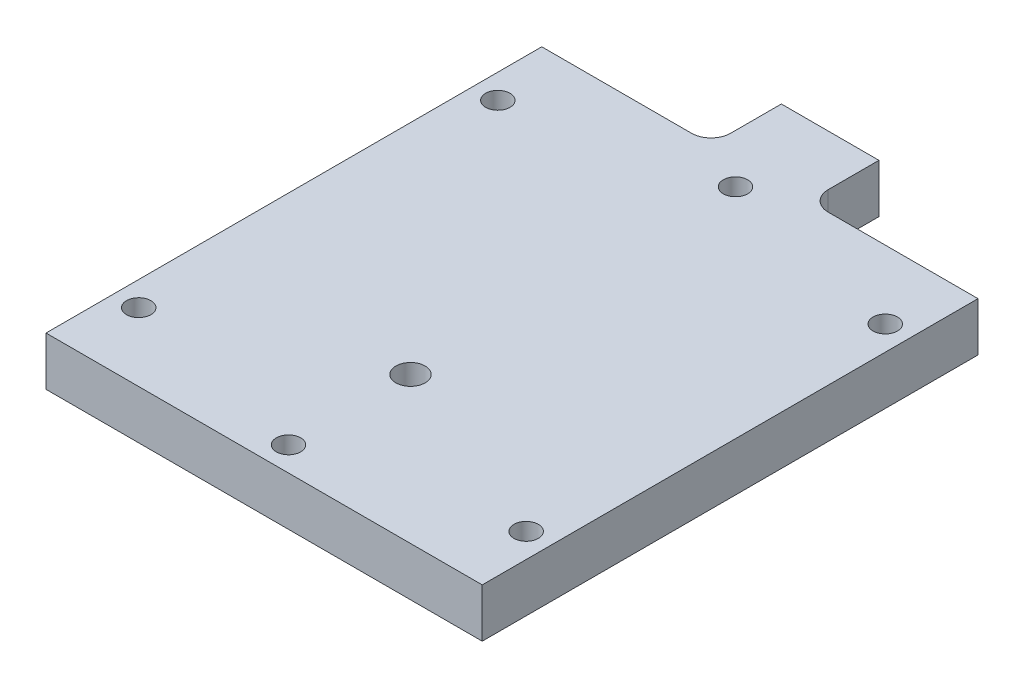
ISO-10303-21;
HEADER;
FILE_DESCRIPTION(('STEP AP214'),'2;1');
FILE_NAME('part.step','',(''),(''),'','','');
FILE_SCHEMA(('AUTOMOTIVE_DESIGN { 1 0 10303 214 1 1 1 1 }'));
ENDSEC;
DATA;
#1=APPLICATION_CONTEXT('core data for automotive mechanical design processes');
#2=APPLICATION_PROTOCOL_DEFINITION('international standard','automotive_design',2000,#1);
#3=PRODUCT_CONTEXT('',#1,'mechanical');
#4=PRODUCT('Part','Part','',(#3));
#5=PRODUCT_RELATED_PRODUCT_CATEGORY('part','',(#4));
#6=PRODUCT_DEFINITION_FORMATION('','',#4);
#7=PRODUCT_DEFINITION_CONTEXT('part definition',#1,'design');
#8=PRODUCT_DEFINITION('design','',#6,#7);
#9=PRODUCT_DEFINITION_SHAPE('','',#8);
#10=(LENGTH_UNIT() NAMED_UNIT(*) SI_UNIT(.MILLI.,.METRE.));
#11=(NAMED_UNIT(*) PLANE_ANGLE_UNIT() SI_UNIT($,.RADIAN.));
#12=(NAMED_UNIT(*) SI_UNIT($,.STERADIAN.) SOLID_ANGLE_UNIT());
#13=UNCERTAINTY_MEASURE_WITH_UNIT(LENGTH_MEASURE(1.E-05),#10,'distance_accuracy_value','');
#14=(GEOMETRIC_REPRESENTATION_CONTEXT(3) GLOBAL_UNCERTAINTY_ASSIGNED_CONTEXT((#13)) GLOBAL_UNIT_ASSIGNED_CONTEXT((#10,
#11,#12)) REPRESENTATION_CONTEXT('',''));
#15=CARTESIAN_POINT('',(0.,0.,0.));
#16=DIRECTION('',(0.,0.,1.));
#17=DIRECTION('',(1.,0.,0.));
#18=AXIS2_PLACEMENT_3D('',#15,#16,#17);
#19=CARTESIAN_POINT('',(7.,5.,-37.7999999999999));
#20=DIRECTION('',(0.,1.,0.));
#21=DIRECTION('',(0.,0.,1.));
#22=AXIS2_PLACEMENT_3D('',#19,#20,#21);
#23=PLANE('',#22);
#24=CARTESIAN_POINT('',(0.,5.,-33.3));
#25=DIRECTION('',(0.,1.,0.));
#26=DIRECTION('',(0.,0.,1.));
#27=AXIS2_PLACEMENT_3D('',#24,#25,#26);
#28=CIRCLE('',#27,1.24999999999999);
#29=CARTESIAN_POINT('',(0.,5.,-32.05));
#30=VERTEX_POINT('',#29);
#31=EDGE_CURVE('E243',#30,#30,#28,.T.);
#32=ORIENTED_EDGE('',*,*,#31,.F.);
#33=EDGE_LOOP('',(#32));
#34=FACE_BOUND('',#33,.T.);
#35=CARTESIAN_POINT('',(19.8500000000001,5.,-28.8000000000002));
#36=DIRECTION('',(0.,1.,0.));
#37=DIRECTION('',(0.,0.,1.));
#38=AXIS2_PLACEMENT_3D('',#35,#36,#37);
#39=CIRCLE('',#38,1.24999999999999);
#40=CARTESIAN_POINT('',(19.8500000000001,5.,-27.5500000000002));
#41=VERTEX_POINT('',#40);
#42=EDGE_CURVE('E237',#41,#41,#39,.T.);
#43=ORIENTED_EDGE('',*,*,#42,.F.);
#44=EDGE_LOOP('',(#43));
#45=FACE_BOUND('',#44,.T.);
#46=CARTESIAN_POINT('',(19.85,5.,7.99999999999989));
#47=DIRECTION('',(0.,1.,0.));
#48=DIRECTION('',(0.,0.,1.));
#49=AXIS2_PLACEMENT_3D('',#46,#47,#48);
#50=CIRCLE('',#49,1.24999999999999);
#51=CARTESIAN_POINT('',(19.85,5.,9.24999999999988));
#52=VERTEX_POINT('',#51);
#53=EDGE_CURVE('E231',#52,#52,#50,.T.);
#54=ORIENTED_EDGE('',*,*,#53,.F.);
#55=EDGE_LOOP('',(#54));
#56=FACE_BOUND('',#55,.T.);
#57=CARTESIAN_POINT('',(0.,5.,12.5000000000001));
#58=DIRECTION('',(0.,1.,0.));
#59=DIRECTION('',(0.,0.,1.));
#60=AXIS2_PLACEMENT_3D('',#57,#58,#59);
#61=CIRCLE('',#60,1.24999999999999);
#62=CARTESIAN_POINT('',(0.,5.,13.7500000000001));
#63=VERTEX_POINT('',#62);
#64=EDGE_CURVE('E225',#63,#63,#61,.T.);
#65=ORIENTED_EDGE('',*,*,#64,.F.);
#66=EDGE_LOOP('',(#65));
#67=FACE_BOUND('',#66,.T.);
#68=CARTESIAN_POINT('',(-19.8500000000001,5.,-28.8000000000002));
#69=DIRECTION('',(0.,1.,0.));
#70=DIRECTION('',(0.,0.,1.));
#71=AXIS2_PLACEMENT_3D('',#68,#69,#70);
#72=CIRCLE('',#71,1.24999999999999);
#73=CARTESIAN_POINT('',(-19.8500000000001,5.,-27.5500000000002));
#74=VERTEX_POINT('',#73);
#75=EDGE_CURVE('E219',#74,#74,#72,.T.);
#76=ORIENTED_EDGE('',*,*,#75,.F.);
#77=EDGE_LOOP('',(#76));
#78=FACE_BOUND('',#77,.T.);
#79=CARTESIAN_POINT('',(-19.8500000000001,5.,8.00000000000004));
#80=DIRECTION('',(0.,1.,0.));
#81=DIRECTION('',(0.,0.,1.));
#82=AXIS2_PLACEMENT_3D('',#79,#80,#81);
#83=CIRCLE('',#82,1.24999999999999);
#84=CARTESIAN_POINT('',(-19.8500000000001,5.,9.25000000000002));
#85=VERTEX_POINT('',#84);
#86=EDGE_CURVE('E213',#85,#85,#83,.T.);
#87=ORIENTED_EDGE('',*,*,#86,.F.);
#88=EDGE_LOOP('',(#87));
#89=FACE_BOUND('',#88,.T.);
#90=DIRECTION('',(0.,0.,1.));
#91=VECTOR('',#90,1.);
#92=CARTESIAN_POINT('',(-22.3500000000001,5.,-35.7999999999999));
#93=LINE('',#92,#91);
#94=CARTESIAN_POINT('',(-22.3500000000001,5.,-35.7999999999999));
#95=VERTEX_POINT('',#94);
#96=CARTESIAN_POINT('',(-22.35,5.,15.));
#97=VERTEX_POINT('',#96);
#98=EDGE_CURVE('E160',#95,#97,#93,.T.);
#99=ORIENTED_EDGE('',*,*,#98,.T.);
#100=DIRECTION('',(1.,0.,0.));
#101=VECTOR('',#100,1.);
#102=CARTESIAN_POINT('',(-22.35,5.,15.));
#103=LINE('',#102,#101);
#104=CARTESIAN_POINT('',(22.3500000000001,5.,15.));
#105=VERTEX_POINT('',#104);
#106=EDGE_CURVE('E98',#97,#105,#103,.T.);
#107=ORIENTED_EDGE('',*,*,#106,.T.);
#108=DIRECTION('',(0.,0.,-1.));
#109=VECTOR('',#108,1.);
#110=CARTESIAN_POINT('',(22.35,5.,-35.7999999999999));
#111=LINE('',#110,#109);
#112=CARTESIAN_POINT('',(22.35,5.,-35.7999999999999));
#113=VERTEX_POINT('',#112);
#114=EDGE_CURVE('E182',#105,#113,#111,.T.);
#115=ORIENTED_EDGE('',*,*,#114,.T.);
#116=DIRECTION('',(-1.,0.,0.));
#117=VECTOR('',#116,1.);
#118=CARTESIAN_POINT('',(7.,5.,-35.7999999999999));
#119=LINE('',#118,#117);
#120=CARTESIAN_POINT('',(7.,5.,-35.7999999999999));
#121=VERTEX_POINT('',#120);
#122=EDGE_CURVE('E200',#113,#121,#119,.T.);
#123=ORIENTED_EDGE('',*,*,#122,.T.);
#124=CARTESIAN_POINT('',(7.,5.,-37.7999999999999));
#125=DIRECTION('',(0.,-1.,0.));
#126=DIRECTION('',(0.,0.,1.));
#127=AXIS2_PLACEMENT_3D('',#124,#125,#126);
#128=CIRCLE('',#127,2.);
#129=CARTESIAN_POINT('',(5.,5.,-37.7999999999999));
#130=VERTEX_POINT('',#129);
#131=EDGE_CURVE('E197',#121,#130,#128,.T.);
#132=ORIENTED_EDGE('',*,*,#131,.T.);
#133=DIRECTION('',(0.,0.,-1.));
#134=VECTOR('',#133,1.);
#135=CARTESIAN_POINT('',(5.,5.,-37.7999999999999));
#136=LINE('',#135,#134);
#137=CARTESIAN_POINT('',(5.,5.,-43.));
#138=VERTEX_POINT('',#137);
#139=EDGE_CURVE('E199',#130,#138,#136,.T.);
#140=ORIENTED_EDGE('',*,*,#139,.T.);
#141=DIRECTION('',(-1.,0.,0.));
#142=VECTOR('',#141,1.);
#143=CARTESIAN_POINT('',(5.,5.,-43.));
#144=LINE('',#143,#142);
#145=CARTESIAN_POINT('',(-5.,5.,-43.));
#146=VERTEX_POINT('',#145);
#147=EDGE_CURVE('E123',#138,#146,#144,.T.);
#148=ORIENTED_EDGE('',*,*,#147,.T.);
#149=DIRECTION('',(0.,0.,1.));
#150=VECTOR('',#149,1.);
#151=CARTESIAN_POINT('',(-5.,5.,-43.));
#152=LINE('',#151,#150);
#153=CARTESIAN_POINT('',(-5.,5.,-37.7999999999999));
#154=VERTEX_POINT('',#153);
#155=EDGE_CURVE('E117',#146,#154,#152,.T.);
#156=ORIENTED_EDGE('',*,*,#155,.T.);
#157=CARTESIAN_POINT('',(-7.,5.,-37.7999999999999));
#158=DIRECTION('',(0.,-1.,0.));
#159=DIRECTION('',(0.,0.,-1.));
#160=AXIS2_PLACEMENT_3D('',#157,#158,#159);
#161=CIRCLE('',#160,2.);
#162=CARTESIAN_POINT('',(-7.,5.,-35.7999999999999));
#163=VERTEX_POINT('',#162);
#164=EDGE_CURVE('E121',#154,#163,#161,.T.);
#165=ORIENTED_EDGE('',*,*,#164,.T.);
#166=DIRECTION('',(-1.,0.,0.));
#167=VECTOR('',#166,1.);
#168=CARTESIAN_POINT('',(-22.3500000000001,5.,-35.7999999999999));
#169=LINE('',#168,#167);
#170=EDGE_CURVE('E49',#163,#95,#169,.T.);
#171=ORIENTED_EDGE('',*,*,#170,.T.);
#172=EDGE_LOOP('',(#99,#107,#115,#123,#132,#140,#148,#156,#165,#171));
#173=FACE_BOUND('',#172,.T.);
#174=CARTESIAN_POINT('',(0.,5.,0.));
#175=DIRECTION('',(0.,1.,0.));
#176=DIRECTION('',(0.,0.,1.));
#177=AXIS2_PLACEMENT_3D('',#174,#175,#176);
#178=CIRCLE('',#177,1.5);
#179=CARTESIAN_POINT('',(0.,5.,1.5));
#180=VERTEX_POINT('',#179);
#181=EDGE_CURVE('E145',#180,#180,#178,.T.);
#182=ORIENTED_EDGE('',*,*,#181,.F.);
#183=EDGE_LOOP('',(#182));
#184=FACE_BOUND('',#183,.T.);
#185=ADVANCED_FACE('F31',(#34,#45,#56,#67,#78,#89,#173,#184),#23,.T.);
#186=CARTESIAN_POINT('',(7.,0.,-37.7999999999999));
#187=DIRECTION('',(0.,1.,0.));
#188=DIRECTION('',(0.,0.,1.));
#189=AXIS2_PLACEMENT_3D('',#186,#187,#188);
#190=PLANE('',#189);
#191=CARTESIAN_POINT('',(0.,0.,0.));
#192=DIRECTION('',(0.,1.,0.));
#193=DIRECTION('',(0.,0.,1.));
#194=AXIS2_PLACEMENT_3D('',#191,#192,#193);
#195=CIRCLE('',#194,2.9);
#196=CARTESIAN_POINT('',(0.,0.,2.9));
#197=VERTEX_POINT('',#196);
#198=EDGE_CURVE('E249',#197,#197,#195,.T.);
#199=ORIENTED_EDGE('',*,*,#198,.T.);
#200=EDGE_LOOP('',(#199));
#201=FACE_BOUND('',#200,.T.);
#202=CARTESIAN_POINT('',(0.,0.,-33.3));
#203=DIRECTION('',(0.,1.,0.));
#204=DIRECTION('',(0.,0.,1.));
#205=AXIS2_PLACEMENT_3D('',#202,#203,#204);
#206=CIRCLE('',#205,1.25);
#207=CARTESIAN_POINT('',(0.,0.,-32.05));
#208=VERTEX_POINT('',#207);
#209=EDGE_CURVE('E240',#208,#208,#206,.T.);
#210=ORIENTED_EDGE('',*,*,#209,.T.);
#211=EDGE_LOOP('',(#210));
#212=FACE_BOUND('',#211,.T.);
#213=CARTESIAN_POINT('',(19.8500000000001,0.,-28.8000000000002));
#214=DIRECTION('',(0.,1.,0.));
#215=DIRECTION('',(0.,0.,1.));
#216=AXIS2_PLACEMENT_3D('',#213,#214,#215);
#217=CIRCLE('',#216,1.25);
#218=CARTESIAN_POINT('',(19.8500000000001,0.,-27.5500000000002));
#219=VERTEX_POINT('',#218);
#220=EDGE_CURVE('E234',#219,#219,#217,.T.);
#221=ORIENTED_EDGE('',*,*,#220,.T.);
#222=EDGE_LOOP('',(#221));
#223=FACE_BOUND('',#222,.T.);
#224=CARTESIAN_POINT('',(19.85,0.,7.99999999999989));
#225=DIRECTION('',(0.,1.,0.));
#226=DIRECTION('',(0.,0.,1.));
#227=AXIS2_PLACEMENT_3D('',#224,#225,#226);
#228=CIRCLE('',#227,1.25);
#229=CARTESIAN_POINT('',(19.85,0.,9.24999999999989));
#230=VERTEX_POINT('',#229);
#231=EDGE_CURVE('E228',#230,#230,#228,.T.);
#232=ORIENTED_EDGE('',*,*,#231,.T.);
#233=EDGE_LOOP('',(#232));
#234=FACE_BOUND('',#233,.T.);
#235=CARTESIAN_POINT('',(0.,0.,12.5000000000001));
#236=DIRECTION('',(0.,1.,0.));
#237=DIRECTION('',(0.,0.,1.));
#238=AXIS2_PLACEMENT_3D('',#235,#236,#237);
#239=CIRCLE('',#238,1.25);
#240=CARTESIAN_POINT('',(0.,0.,13.7500000000001));
#241=VERTEX_POINT('',#240);
#242=EDGE_CURVE('E222',#241,#241,#239,.T.);
#243=ORIENTED_EDGE('',*,*,#242,.T.);
#244=EDGE_LOOP('',(#243));
#245=FACE_BOUND('',#244,.T.);
#246=CARTESIAN_POINT('',(-19.8500000000001,0.,-28.8000000000002));
#247=DIRECTION('',(0.,1.,0.));
#248=DIRECTION('',(0.,0.,1.));
#249=AXIS2_PLACEMENT_3D('',#246,#247,#248);
#250=CIRCLE('',#249,1.25);
#251=CARTESIAN_POINT('',(-19.8500000000001,0.,-27.5500000000002));
#252=VERTEX_POINT('',#251);
#253=EDGE_CURVE('E216',#252,#252,#250,.T.);
#254=ORIENTED_EDGE('',*,*,#253,.T.);
#255=EDGE_LOOP('',(#254));
#256=FACE_BOUND('',#255,.T.);
#257=CARTESIAN_POINT('',(-19.8500000000001,0.,8.00000000000004));
#258=DIRECTION('',(0.,1.,0.));
#259=DIRECTION('',(0.,0.,1.));
#260=AXIS2_PLACEMENT_3D('',#257,#258,#259);
#261=CIRCLE('',#260,1.25);
#262=CARTESIAN_POINT('',(-19.8500000000001,0.,9.25000000000003));
#263=VERTEX_POINT('',#262);
#264=EDGE_CURVE('E210',#263,#263,#261,.T.);
#265=ORIENTED_EDGE('',*,*,#264,.T.);
#266=EDGE_LOOP('',(#265));
#267=FACE_BOUND('',#266,.T.);
#268=DIRECTION('',(0.,0.,1.));
#269=VECTOR('',#268,1.);
#270=CARTESIAN_POINT('',(-22.3500000000001,0.,-35.7999999999999));
#271=LINE('',#270,#269);
#272=CARTESIAN_POINT('',(-22.3500000000001,0.,-35.7999999999999));
#273=VERTEX_POINT('',#272);
#274=CARTESIAN_POINT('',(-22.35,0.,15.));
#275=VERTEX_POINT('',#274);
#276=EDGE_CURVE('E141',#273,#275,#271,.T.);
#277=ORIENTED_EDGE('',*,*,#276,.F.);
#278=DIRECTION('',(-1.,0.,0.));
#279=VECTOR('',#278,1.);
#280=CARTESIAN_POINT('',(-22.3500000000001,0.,-35.7999999999999));
#281=LINE('',#280,#279);
#282=CARTESIAN_POINT('',(-7.,0.,-35.7999999999999));
#283=VERTEX_POINT('',#282);
#284=EDGE_CURVE('E90',#283,#273,#281,.T.);
#285=ORIENTED_EDGE('',*,*,#284,.F.);
#286=CARTESIAN_POINT('',(-7.,0.,-37.7999999999999));
#287=DIRECTION('',(0.,-1.,0.));
#288=DIRECTION('',(0.,0.,-1.));
#289=AXIS2_PLACEMENT_3D('',#286,#287,#288);
#290=CIRCLE('',#289,2.);
#291=CARTESIAN_POINT('',(-5.,0.,-37.7999999999999));
#292=VERTEX_POINT('',#291);
#293=EDGE_CURVE('E84',#292,#283,#290,.T.);
#294=ORIENTED_EDGE('',*,*,#293,.F.);
#295=DIRECTION('',(0.,0.,1.));
#296=VECTOR('',#295,1.);
#297=CARTESIAN_POINT('',(-5.,0.,-43.));
#298=LINE('',#297,#296);
#299=CARTESIAN_POINT('',(-5.,0.,-43.));
#300=VERTEX_POINT('',#299);
#301=EDGE_CURVE('E131',#300,#292,#298,.T.);
#302=ORIENTED_EDGE('',*,*,#301,.F.);
#303=DIRECTION('',(-1.,0.,0.));
#304=VECTOR('',#303,1.);
#305=CARTESIAN_POINT('',(5.,0.,-43.));
#306=LINE('',#305,#304);
#307=CARTESIAN_POINT('',(5.,0.,-43.));
#308=VERTEX_POINT('',#307);
#309=EDGE_CURVE('E155',#308,#300,#306,.T.);
#310=ORIENTED_EDGE('',*,*,#309,.F.);
#311=DIRECTION('',(0.,0.,-1.));
#312=VECTOR('',#311,1.);
#313=CARTESIAN_POINT('',(5.,0.,-37.7999999999999));
#314=LINE('',#313,#312);
#315=CARTESIAN_POINT('',(5.,0.,-37.7999999999999));
#316=VERTEX_POINT('',#315);
#317=EDGE_CURVE('E153',#316,#308,#314,.T.);
#318=ORIENTED_EDGE('',*,*,#317,.F.);
#319=CARTESIAN_POINT('',(7.,0.,-37.7999999999999));
#320=DIRECTION('',(0.,-1.,0.));
#321=DIRECTION('',(0.,0.,1.));
#322=AXIS2_PLACEMENT_3D('',#319,#320,#321);
#323=CIRCLE('',#322,2.);
#324=CARTESIAN_POINT('',(7.,0.,-35.7999999999999));
#325=VERTEX_POINT('',#324);
#326=EDGE_CURVE('E151',#325,#316,#323,.T.);
#327=ORIENTED_EDGE('',*,*,#326,.F.);
#328=DIRECTION('',(-1.,0.,0.));
#329=VECTOR('',#328,1.);
#330=CARTESIAN_POINT('',(7.,0.,-35.7999999999999));
#331=LINE('',#330,#329);
#332=CARTESIAN_POINT('',(22.35,0.,-35.7999999999999));
#333=VERTEX_POINT('',#332);
#334=EDGE_CURVE('E149',#333,#325,#331,.T.);
#335=ORIENTED_EDGE('',*,*,#334,.F.);
#336=DIRECTION('',(0.,0.,-1.));
#337=VECTOR('',#336,1.);
#338=CARTESIAN_POINT('',(22.35,0.,-35.7999999999999));
#339=LINE('',#338,#337);
#340=CARTESIAN_POINT('',(22.3500000000001,0.,15.));
#341=VERTEX_POINT('',#340);
#342=EDGE_CURVE('E147',#341,#333,#339,.T.);
#343=ORIENTED_EDGE('',*,*,#342,.F.);
#344=DIRECTION('',(1.,0.,0.));
#345=VECTOR('',#344,1.);
#346=CARTESIAN_POINT('',(-22.35,0.,15.));
#347=LINE('',#346,#345);
#348=EDGE_CURVE('E144',#275,#341,#347,.T.);
#349=ORIENTED_EDGE('',*,*,#348,.F.);
#350=EDGE_LOOP('',(#277,#285,#294,#302,#310,#318,#327,#335,#343,#349));
#351=FACE_BOUND('',#350,.T.);
#352=ADVANCED_FACE('F186',(#201,#212,#223,#234,#245,#256,#267,#351),#190,.F.);
#353=CARTESIAN_POINT('',(-22.3500000000001,5.,-35.7999999999999));
#354=DIRECTION('',(1.,0.,0.));
#355=DIRECTION('',(0.,0.,-1.));
#356=AXIS2_PLACEMENT_3D('',#353,#354,#355);
#357=PLANE('',#356);
#358=ORIENTED_EDGE('',*,*,#276,.T.);
#359=DIRECTION('',(0.,-1.,0.));
#360=VECTOR('',#359,1.);
#361=CARTESIAN_POINT('',(-22.35,5.,15.));
#362=LINE('',#361,#360);
#363=EDGE_CURVE('E11',#97,#275,#362,.T.);
#364=ORIENTED_EDGE('',*,*,#363,.F.);
#365=ORIENTED_EDGE('',*,*,#98,.F.);
#366=DIRECTION('',(0.,-1.,0.));
#367=VECTOR('',#366,1.);
#368=CARTESIAN_POINT('',(-22.3500000000001,5.,-35.7999999999999));
#369=LINE('',#368,#367);
#370=EDGE_CURVE('E137',#95,#273,#369,.T.);
#371=ORIENTED_EDGE('',*,*,#370,.T.);
#372=EDGE_LOOP('',(#358,#364,#365,#371));
#373=FACE_BOUND('',#372,.T.);
#374=ADVANCED_FACE('F33',(#373),#357,.F.);
#375=CARTESIAN_POINT('',(-22.35,5.,15.));
#376=DIRECTION('',(0.,0.,-1.));
#377=DIRECTION('',(-1.,0.,0.));
#378=AXIS2_PLACEMENT_3D('',#375,#376,#377);
#379=PLANE('',#378);
#380=ORIENTED_EDGE('',*,*,#348,.T.);
#381=DIRECTION('',(0.,-1.,0.));
#382=VECTOR('',#381,1.);
#383=CARTESIAN_POINT('',(22.3500000000001,5.,15.));
#384=LINE('',#383,#382);
#385=EDGE_CURVE('E41',#105,#341,#384,.T.);
#386=ORIENTED_EDGE('',*,*,#385,.F.);
#387=ORIENTED_EDGE('',*,*,#106,.F.);
#388=ORIENTED_EDGE('',*,*,#363,.T.);
#389=EDGE_LOOP('',(#380,#386,#387,#388));
#390=FACE_BOUND('',#389,.T.);
#391=ADVANCED_FACE('F296',(#390),#379,.F.);
#392=CARTESIAN_POINT('',(22.35,5.,-35.7999999999999));
#393=DIRECTION('',(-1.,0.,0.));
#394=DIRECTION('',(0.,0.,1.));
#395=AXIS2_PLACEMENT_3D('',#392,#393,#394);
#396=PLANE('',#395);
#397=ORIENTED_EDGE('',*,*,#342,.T.);
#398=DIRECTION('',(0.,-1.,0.));
#399=VECTOR('',#398,1.);
#400=CARTESIAN_POINT('',(22.35,5.,-35.7999999999999));
#401=LINE('',#400,#399);
#402=EDGE_CURVE('E173',#113,#333,#401,.T.);
#403=ORIENTED_EDGE('',*,*,#402,.F.);
#404=ORIENTED_EDGE('',*,*,#114,.F.);
#405=ORIENTED_EDGE('',*,*,#385,.T.);
#406=EDGE_LOOP('',(#397,#403,#404,#405));
#407=FACE_BOUND('',#406,.T.);
#408=ADVANCED_FACE('F180',(#407),#396,.F.);
#409=CARTESIAN_POINT('',(7.,5.,-35.7999999999999));
#410=DIRECTION('',(0.,0.,1.));
#411=DIRECTION('',(1.,0.,0.));
#412=AXIS2_PLACEMENT_3D('',#409,#410,#411);
#413=PLANE('',#412);
#414=ORIENTED_EDGE('',*,*,#334,.T.);
#415=DIRECTION('',(0.,-1.,0.));
#416=VECTOR('',#415,1.);
#417=CARTESIAN_POINT('',(7.,5.,-35.7999999999999));
#418=LINE('',#417,#416);
#419=EDGE_CURVE('E170',#121,#325,#418,.T.);
#420=ORIENTED_EDGE('',*,*,#419,.F.);
#421=ORIENTED_EDGE('',*,*,#122,.F.);
#422=ORIENTED_EDGE('',*,*,#402,.T.);
#423=EDGE_LOOP('',(#414,#420,#421,#422));
#424=FACE_BOUND('',#423,.T.);
#425=ADVANCED_FACE('F191',(#424),#413,.F.);
#426=CARTESIAN_POINT('',(7.,5.,-37.7999999999999));
#427=DIRECTION('',(0.,-1.,0.));
#428=DIRECTION('',(0.,0.,-1.));
#429=AXIS2_PLACEMENT_3D('',#426,#427,#428);
#430=CYLINDRICAL_SURFACE('',#429,2.);
#431=ORIENTED_EDGE('',*,*,#326,.T.);
#432=DIRECTION('',(0.,-1.,0.));
#433=VECTOR('',#432,1.);
#434=CARTESIAN_POINT('',(5.,5.,-37.7999999999999));
#435=LINE('',#434,#433);
#436=EDGE_CURVE('E167',#130,#316,#435,.T.);
#437=ORIENTED_EDGE('',*,*,#436,.F.);
#438=ORIENTED_EDGE('',*,*,#131,.F.);
#439=ORIENTED_EDGE('',*,*,#419,.T.);
#440=EDGE_LOOP('',(#431,#437,#438,#439));
#441=FACE_BOUND('',#440,.T.);
#442=ADVANCED_FACE('F195',(#441),#430,.F.);
#443=CARTESIAN_POINT('',(5.,5.,-37.7999999999999));
#444=DIRECTION('',(-1.,0.,0.));
#445=DIRECTION('',(0.,0.,1.));
#446=AXIS2_PLACEMENT_3D('',#443,#444,#445);
#447=PLANE('',#446);
#448=ORIENTED_EDGE('',*,*,#317,.T.);
#449=DIRECTION('',(0.,-1.,0.));
#450=VECTOR('',#449,1.);
#451=CARTESIAN_POINT('',(5.,5.,-43.));
#452=LINE('',#451,#450);
#453=EDGE_CURVE('E164',#138,#308,#452,.T.);
#454=ORIENTED_EDGE('',*,*,#453,.F.);
#455=ORIENTED_EDGE('',*,*,#139,.F.);
#456=ORIENTED_EDGE('',*,*,#436,.T.);
#457=EDGE_LOOP('',(#448,#454,#455,#456));
#458=FACE_BOUND('',#457,.T.);
#459=ADVANCED_FACE('F286',(#458),#447,.F.);
#460=CARTESIAN_POINT('',(5.,5.,-43.));
#461=DIRECTION('',(0.,0.,1.));
#462=DIRECTION('',(1.,0.,0.));
#463=AXIS2_PLACEMENT_3D('',#460,#461,#462);
#464=PLANE('',#463);
#465=ORIENTED_EDGE('',*,*,#309,.T.);
#466=DIRECTION('',(0.,-1.,0.));
#467=VECTOR('',#466,1.);
#468=CARTESIAN_POINT('',(-5.,5.,-43.));
#469=LINE('',#468,#467);
#470=EDGE_CURVE('E132',#146,#300,#469,.T.);
#471=ORIENTED_EDGE('',*,*,#470,.F.);
#472=ORIENTED_EDGE('',*,*,#147,.F.);
#473=ORIENTED_EDGE('',*,*,#453,.T.);
#474=EDGE_LOOP('',(#465,#471,#472,#473));
#475=FACE_BOUND('',#474,.T.);
#476=ADVANCED_FACE('F283',(#475),#464,.F.);
#477=CARTESIAN_POINT('',(-5.,5.,-43.));
#478=DIRECTION('',(1.,0.,0.));
#479=DIRECTION('',(0.,0.,-1.));
#480=AXIS2_PLACEMENT_3D('',#477,#478,#479);
#481=PLANE('',#480);
#482=ORIENTED_EDGE('',*,*,#301,.T.);
#483=DIRECTION('',(0.,-1.,0.));
#484=VECTOR('',#483,1.);
#485=CARTESIAN_POINT('',(-5.,5.,-37.7999999999999));
#486=LINE('',#485,#484);
#487=EDGE_CURVE('E128',#154,#292,#486,.T.);
#488=ORIENTED_EDGE('',*,*,#487,.F.);
#489=ORIENTED_EDGE('',*,*,#155,.F.);
#490=ORIENTED_EDGE('',*,*,#470,.T.);
#491=EDGE_LOOP('',(#482,#488,#489,#490));
#492=FACE_BOUND('',#491,.T.);
#493=ADVANCED_FACE('F129',(#492),#481,.F.);
#494=CARTESIAN_POINT('',(-7.,5.,-37.7999999999999));
#495=DIRECTION('',(0.,-1.,0.));
#496=DIRECTION('',(0.,0.,-1.));
#497=AXIS2_PLACEMENT_3D('',#494,#495,#496);
#498=CYLINDRICAL_SURFACE('',#497,2.);
#499=ORIENTED_EDGE('',*,*,#293,.T.);
#500=DIRECTION('',(0.,-1.,0.));
#501=VECTOR('',#500,1.);
#502=CARTESIAN_POINT('',(-7.,5.,-35.7999999999999));
#503=LINE('',#502,#501);
#504=EDGE_CURVE('E133',#163,#283,#503,.T.);
#505=ORIENTED_EDGE('',*,*,#504,.F.);
#506=ORIENTED_EDGE('',*,*,#164,.F.);
#507=ORIENTED_EDGE('',*,*,#487,.T.);
#508=EDGE_LOOP('',(#499,#505,#506,#507));
#509=FACE_BOUND('',#508,.T.);
#510=ADVANCED_FACE('F135',(#509),#498,.F.);
#511=CARTESIAN_POINT('',(-22.3500000000001,5.,-35.7999999999999));
#512=DIRECTION('',(0.,0.,1.));
#513=DIRECTION('',(1.,0.,0.));
#514=AXIS2_PLACEMENT_3D('',#511,#512,#513);
#515=PLANE('',#514);
#516=ORIENTED_EDGE('',*,*,#284,.T.);
#517=ORIENTED_EDGE('',*,*,#370,.F.);
#518=ORIENTED_EDGE('',*,*,#170,.F.);
#519=ORIENTED_EDGE('',*,*,#504,.T.);
#520=EDGE_LOOP('',(#516,#517,#518,#519));
#521=FACE_BOUND('',#520,.T.);
#522=ADVANCED_FACE('F263',(#521),#515,.F.);
#523=CARTESIAN_POINT('',(0.,5.,0.));
#524=DIRECTION('',(0.,-1.,0.));
#525=DIRECTION('',(0.,0.,-1.));
#526=AXIS2_PLACEMENT_3D('',#523,#524,#525);
#527=CYLINDRICAL_SURFACE('',#526,1.5);
#528=CARTESIAN_POINT('',(0.,2.69999999999999,0.));
#529=DIRECTION('',(0.,1.,0.));
#530=DIRECTION('',(0.,0.,1.));
#531=AXIS2_PLACEMENT_3D('',#528,#529,#530);
#532=CIRCLE('',#531,1.5);
#533=CARTESIAN_POINT('',(0.,2.69999999999999,1.5));
#534=VERTEX_POINT('',#533);
#535=EDGE_CURVE('E35',#534,#534,#532,.T.);
#536=ORIENTED_EDGE('',*,*,#535,.F.);
#537=EDGE_LOOP('',(#536));
#538=FACE_BOUND('',#537,.T.);
#539=ORIENTED_EDGE('',*,*,#181,.T.);
#540=EDGE_LOOP('',(#539));
#541=FACE_BOUND('',#540,.T.);
#542=ADVANCED_FACE('F259',(#538,#541),#527,.F.);
#543=CARTESIAN_POINT('',(-19.8500000000001,5.,8.00000000000004));
#544=DIRECTION('',(0.,1.,0.));
#545=DIRECTION('',(0.,0.,1.));
#546=AXIS2_PLACEMENT_3D('',#543,#544,#545);
#547=CYLINDRICAL_SURFACE('',#546,1.24999999999999);
#548=ORIENTED_EDGE('',*,*,#264,.F.);
#549=EDGE_LOOP('',(#548));
#550=FACE_BOUND('',#549,.T.);
#551=ORIENTED_EDGE('',*,*,#86,.T.);
#552=EDGE_LOOP('',(#551));
#553=FACE_BOUND('',#552,.T.);
#554=ADVANCED_FACE('F262',(#550,#553),#547,.F.);
#555=CARTESIAN_POINT('',(-19.8500000000001,5.,-28.8000000000002));
#556=DIRECTION('',(0.,1.,0.));
#557=DIRECTION('',(0.,0.,1.));
#558=AXIS2_PLACEMENT_3D('',#555,#556,#557);
#559=CYLINDRICAL_SURFACE('',#558,1.24999999999999);
#560=ORIENTED_EDGE('',*,*,#253,.F.);
#561=EDGE_LOOP('',(#560));
#562=FACE_BOUND('',#561,.T.);
#563=ORIENTED_EDGE('',*,*,#75,.T.);
#564=EDGE_LOOP('',(#563));
#565=FACE_BOUND('',#564,.T.);
#566=ADVANCED_FACE('F364',(#562,#565),#559,.F.);
#567=CARTESIAN_POINT('',(0.,5.,12.5000000000001));
#568=DIRECTION('',(0.,1.,0.));
#569=DIRECTION('',(0.,0.,1.));
#570=AXIS2_PLACEMENT_3D('',#567,#568,#569);
#571=CYLINDRICAL_SURFACE('',#570,1.24999999999999);
#572=ORIENTED_EDGE('',*,*,#242,.F.);
#573=EDGE_LOOP('',(#572));
#574=FACE_BOUND('',#573,.T.);
#575=ORIENTED_EDGE('',*,*,#64,.T.);
#576=EDGE_LOOP('',(#575));
#577=FACE_BOUND('',#576,.T.);
#578=ADVANCED_FACE('F360',(#574,#577),#571,.F.);
#579=CARTESIAN_POINT('',(19.85,5.,7.99999999999989));
#580=DIRECTION('',(0.,1.,0.));
#581=DIRECTION('',(0.,0.,1.));
#582=AXIS2_PLACEMENT_3D('',#579,#580,#581);
#583=CYLINDRICAL_SURFACE('',#582,1.24999999999999);
#584=ORIENTED_EDGE('',*,*,#231,.F.);
#585=EDGE_LOOP('',(#584));
#586=FACE_BOUND('',#585,.T.);
#587=ORIENTED_EDGE('',*,*,#53,.T.);
#588=EDGE_LOOP('',(#587));
#589=FACE_BOUND('',#588,.T.);
#590=ADVANCED_FACE('F356',(#586,#589),#583,.F.);
#591=CARTESIAN_POINT('',(19.8500000000001,5.,-28.8000000000002));
#592=DIRECTION('',(0.,1.,0.));
#593=DIRECTION('',(0.,0.,1.));
#594=AXIS2_PLACEMENT_3D('',#591,#592,#593);
#595=CYLINDRICAL_SURFACE('',#594,1.24999999999999);
#596=ORIENTED_EDGE('',*,*,#220,.F.);
#597=EDGE_LOOP('',(#596));
#598=FACE_BOUND('',#597,.T.);
#599=ORIENTED_EDGE('',*,*,#42,.T.);
#600=EDGE_LOOP('',(#599));
#601=FACE_BOUND('',#600,.T.);
#602=ADVANCED_FACE('F352',(#598,#601),#595,.F.);
#603=CARTESIAN_POINT('',(0.,5.,-33.3));
#604=DIRECTION('',(0.,1.,0.));
#605=DIRECTION('',(0.,0.,1.));
#606=AXIS2_PLACEMENT_3D('',#603,#604,#605);
#607=CYLINDRICAL_SURFACE('',#606,1.24999999999999);
#608=ORIENTED_EDGE('',*,*,#209,.F.);
#609=EDGE_LOOP('',(#608));
#610=FACE_BOUND('',#609,.T.);
#611=ORIENTED_EDGE('',*,*,#31,.T.);
#612=EDGE_LOOP('',(#611));
#613=FACE_BOUND('',#612,.T.);
#614=ADVANCED_FACE('F319',(#610,#613),#607,.F.);
#615=CARTESIAN_POINT('',(0.,0.,0.));
#616=DIRECTION('',(0.,1.,0.));
#617=DIRECTION('',(0.,0.,1.));
#618=AXIS2_PLACEMENT_3D('',#615,#616,#617);
#619=CYLINDRICAL_SURFACE('',#618,2.9);
#620=ORIENTED_EDGE('',*,*,#198,.F.);
#621=EDGE_LOOP('',(#620));
#622=FACE_BOUND('',#621,.T.);
#623=CARTESIAN_POINT('',(0.,2.69999999999999,0.));
#624=DIRECTION('',(0.,1.,0.));
#625=DIRECTION('',(0.,0.,1.));
#626=AXIS2_PLACEMENT_3D('',#623,#624,#625);
#627=CIRCLE('',#626,2.9);
#628=CARTESIAN_POINT('',(0.,2.69999999999999,2.9));
#629=VERTEX_POINT('',#628);
#630=EDGE_CURVE('E246',#629,#629,#627,.T.);
#631=ORIENTED_EDGE('',*,*,#630,.T.);
#632=EDGE_LOOP('',(#631));
#633=FACE_BOUND('',#632,.T.);
#634=ADVANCED_FACE('F333',(#622,#633),#619,.F.);
#635=CARTESIAN_POINT('',(0.,2.69999999999999,0.));
#636=DIRECTION('',(0.,1.,0.));
#637=DIRECTION('',(0.,0.,1.));
#638=AXIS2_PLACEMENT_3D('',#635,#636,#637);
#639=PLANE('',#638);
#640=ORIENTED_EDGE('',*,*,#535,.T.);
#641=EDGE_LOOP('',(#640));
#642=FACE_BOUND('',#641,.T.);
#643=ORIENTED_EDGE('',*,*,#630,.F.);
#644=EDGE_LOOP('',(#643));
#645=FACE_BOUND('',#644,.T.);
#646=ADVANCED_FACE('F256',(#642,#645),#639,.F.);
#647=CLOSED_SHELL('',(#185,#352,#374,#391,#408,#425,#442,#459,#476,#493,#510,#522,#542,#554,
#566,#578,#590,#602,#614,#634,#646));
#648=MANIFOLD_SOLID_BREP('B2',#647);
#649=ADVANCED_BREP_SHAPE_REPRESENTATION('',(#18,#648),#14);
#650=SHAPE_DEFINITION_REPRESENTATION(#9,#649);
ENDSEC;
END-ISO-10303-21;
